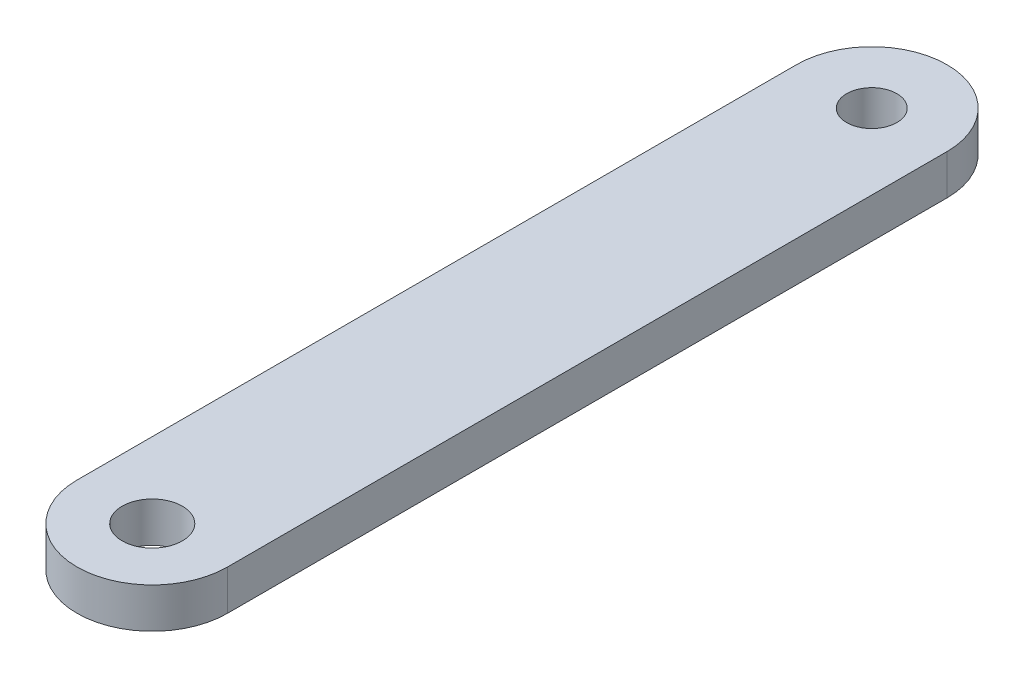
ISO-10303-21;
HEADER;
FILE_DESCRIPTION(('STEP AP214'),'2;1');
FILE_NAME('part.step','',(''),(''),'','','');
FILE_SCHEMA(('AUTOMOTIVE_DESIGN { 1 0 10303 214 1 1 1 1 }'));
ENDSEC;
DATA;
#1=APPLICATION_CONTEXT('core data for automotive mechanical design processes');
#2=APPLICATION_PROTOCOL_DEFINITION('international standard','automotive_design',2000,#1);
#3=PRODUCT_CONTEXT('',#1,'mechanical');
#4=PRODUCT('Part','Part','',(#3));
#5=PRODUCT_RELATED_PRODUCT_CATEGORY('part','',(#4));
#6=PRODUCT_DEFINITION_FORMATION('','',#4);
#7=PRODUCT_DEFINITION_CONTEXT('part definition',#1,'design');
#8=PRODUCT_DEFINITION('design','',#6,#7);
#9=PRODUCT_DEFINITION_SHAPE('','',#8);
#10=(LENGTH_UNIT() NAMED_UNIT(*) SI_UNIT(.MILLI.,.METRE.));
#11=(NAMED_UNIT(*) PLANE_ANGLE_UNIT() SI_UNIT($,.RADIAN.));
#12=(NAMED_UNIT(*) SI_UNIT($,.STERADIAN.) SOLID_ANGLE_UNIT());
#13=UNCERTAINTY_MEASURE_WITH_UNIT(LENGTH_MEASURE(1.E-05),#10,'distance_accuracy_value','');
#14=(GEOMETRIC_REPRESENTATION_CONTEXT(3) GLOBAL_UNCERTAINTY_ASSIGNED_CONTEXT((#13)) GLOBAL_UNIT_ASSIGNED_CONTEXT((#10,
#11,#12)) REPRESENTATION_CONTEXT('',''));
#15=CARTESIAN_POINT('',(0.,0.,0.));
#16=DIRECTION('',(0.,0.,1.));
#17=DIRECTION('',(1.,0.,0.));
#18=AXIS2_PLACEMENT_3D('',#15,#16,#17);
#19=CARTESIAN_POINT('',(1.29120762711864,2.,4.82304025423729));
#20=DIRECTION('',(0.,1.,0.));
#21=DIRECTION('',(0.,0.,1.));
#22=AXIS2_PLACEMENT_3D('',#19,#20,#21);
#23=PLANE('',#22);
#24=CARTESIAN_POINT('',(1.29120762711864,2.,-31.0269597457627));
#25=DIRECTION('',(0.,1.,0.));
#26=DIRECTION('',(0.,0.,1.));
#27=AXIS2_PLACEMENT_3D('',#24,#25,#26);
#28=CIRCLE('',#27,1.25);
#29=CARTESIAN_POINT('',(1.29120762711864,2.,-29.7769597457627));
#30=VERTEX_POINT('',#29);
#31=EDGE_CURVE('E100',#30,#30,#28,.T.);
#32=ORIENTED_EDGE('',*,*,#31,.F.);
#33=EDGE_LOOP('',(#32));
#34=FACE_BOUND('',#33,.T.);
#35=CARTESIAN_POINT('',(1.29120762711864,2.,4.82304025423729));
#36=DIRECTION('',(0.,1.,0.));
#37=DIRECTION('',(0.,0.,1.));
#38=AXIS2_PLACEMENT_3D('',#35,#36,#37);
#39=CIRCLE('',#38,3.75);
#40=CARTESIAN_POINT('',(-2.45879237288136,2.,4.82304025423729));
#41=VERTEX_POINT('',#40);
#42=CARTESIAN_POINT('',(5.04120762711864,2.,4.82304025423729));
#43=VERTEX_POINT('',#42);
#44=EDGE_CURVE('E85',#41,#43,#39,.T.);
#45=ORIENTED_EDGE('',*,*,#44,.T.);
#46=DIRECTION('',(0.,0.,-1.));
#47=VECTOR('',#46,1.);
#48=CARTESIAN_POINT('',(5.04120762711864,2.,-31.0269597457627));
#49=LINE('',#48,#47);
#50=CARTESIAN_POINT('',(5.04120762711864,2.,-31.0269597457627));
#51=VERTEX_POINT('',#50);
#52=EDGE_CURVE('E80',#43,#51,#49,.T.);
#53=ORIENTED_EDGE('',*,*,#52,.T.);
#54=CARTESIAN_POINT('',(1.29120762711864,2.,-31.0269597457627));
#55=DIRECTION('',(0.,1.,0.));
#56=DIRECTION('',(0.,0.,1.));
#57=AXIS2_PLACEMENT_3D('',#54,#55,#56);
#58=CIRCLE('',#57,3.75);
#59=CARTESIAN_POINT('',(-2.45879237288136,2.,-31.0269597457627));
#60=VERTEX_POINT('',#59);
#61=EDGE_CURVE('E83',#51,#60,#58,.T.);
#62=ORIENTED_EDGE('',*,*,#61,.T.);
#63=DIRECTION('',(0.,0.,1.));
#64=VECTOR('',#63,1.);
#65=CARTESIAN_POINT('',(-2.45879237288136,2.,4.82304025423729));
#66=LINE('',#65,#64);
#67=EDGE_CURVE('E50',#60,#41,#66,.T.);
#68=ORIENTED_EDGE('',*,*,#67,.T.);
#69=EDGE_LOOP('',(#45,#53,#62,#68));
#70=FACE_BOUND('',#69,.T.);
#71=CARTESIAN_POINT('',(1.29120762711864,2.,4.82304025423729));
#72=DIRECTION('',(0.,1.,0.));
#73=DIRECTION('',(0.,0.,1.));
#74=AXIS2_PLACEMENT_3D('',#71,#72,#73);
#75=CIRCLE('',#74,1.5);
#76=CARTESIAN_POINT('',(1.29120762711864,2.,6.32304025423729));
#77=VERTEX_POINT('',#76);
#78=EDGE_CURVE('E115',#77,#77,#75,.T.);
#79=ORIENTED_EDGE('',*,*,#78,.F.);
#80=EDGE_LOOP('',(#79));
#81=FACE_BOUND('',#80,.T.);
#82=ADVANCED_FACE('F33',(#34,#70,#81),#23,.T.);
#83=CARTESIAN_POINT('',(1.29120762711864,0.,4.82304025423729));
#84=DIRECTION('',(0.,1.,0.));
#85=DIRECTION('',(0.,0.,1.));
#86=AXIS2_PLACEMENT_3D('',#83,#84,#85);
#87=PLANE('',#86);
#88=CARTESIAN_POINT('',(1.29120762711864,0.,4.82304025423729));
#89=DIRECTION('',(0.,1.,0.));
#90=DIRECTION('',(0.,0.,1.));
#91=AXIS2_PLACEMENT_3D('',#88,#89,#90);
#92=CIRCLE('',#91,3.75);
#93=CARTESIAN_POINT('',(-2.45879237288136,0.,4.82304025423729));
#94=VERTEX_POINT('',#93);
#95=CARTESIAN_POINT('',(5.04120762711864,0.,4.82304025423729));
#96=VERTEX_POINT('',#95);
#97=EDGE_CURVE('E97',#94,#96,#92,.T.);
#98=ORIENTED_EDGE('',*,*,#97,.F.);
#99=DIRECTION('',(0.,0.,1.));
#100=VECTOR('',#99,1.);
#101=CARTESIAN_POINT('',(-2.45879237288136,0.,4.82304025423729));
#102=LINE('',#101,#100);
#103=CARTESIAN_POINT('',(-2.45879237288136,0.,-31.0269597457627));
#104=VERTEX_POINT('',#103);
#105=EDGE_CURVE('E73',#104,#94,#102,.T.);
#106=ORIENTED_EDGE('',*,*,#105,.F.);
#107=CARTESIAN_POINT('',(1.29120762711864,0.,-31.0269597457627));
#108=DIRECTION('',(0.,1.,0.));
#109=DIRECTION('',(0.,0.,1.));
#110=AXIS2_PLACEMENT_3D('',#107,#108,#109);
#111=CIRCLE('',#110,3.75);
#112=CARTESIAN_POINT('',(5.04120762711864,0.,-31.0269597457627));
#113=VERTEX_POINT('',#112);
#114=EDGE_CURVE('E67',#113,#104,#111,.T.);
#115=ORIENTED_EDGE('',*,*,#114,.F.);
#116=DIRECTION('',(0.,0.,-1.));
#117=VECTOR('',#116,1.);
#118=CARTESIAN_POINT('',(5.04120762711864,0.,-31.0269597457627));
#119=LINE('',#118,#117);
#120=EDGE_CURVE('E89',#96,#113,#119,.T.);
#121=ORIENTED_EDGE('',*,*,#120,.F.);
#122=EDGE_LOOP('',(#98,#106,#115,#121));
#123=FACE_BOUND('',#122,.T.);
#124=CARTESIAN_POINT('',(1.29120762711864,0.,-31.0269597457627));
#125=DIRECTION('',(0.,1.,0.));
#126=DIRECTION('',(0.,0.,1.));
#127=AXIS2_PLACEMENT_3D('',#124,#125,#126);
#128=CIRCLE('',#127,1.25);
#129=CARTESIAN_POINT('',(1.29120762711864,0.,-29.7769597457627));
#130=VERTEX_POINT('',#129);
#131=EDGE_CURVE('E112',#130,#130,#128,.T.);
#132=ORIENTED_EDGE('',*,*,#131,.T.);
#133=EDGE_LOOP('',(#132));
#134=FACE_BOUND('',#133,.T.);
#135=CARTESIAN_POINT('',(1.29120762711864,0.,4.82304025423729));
#136=DIRECTION('',(0.,1.,0.));
#137=DIRECTION('',(0.,0.,1.));
#138=AXIS2_PLACEMENT_3D('',#135,#136,#137);
#139=CIRCLE('',#138,1.5);
#140=CARTESIAN_POINT('',(1.29120762711864,0.,6.32304025423729));
#141=VERTEX_POINT('',#140);
#142=EDGE_CURVE('E118',#141,#141,#139,.T.);
#143=ORIENTED_EDGE('',*,*,#142,.T.);
#144=EDGE_LOOP('',(#143));
#145=FACE_BOUND('',#144,.T.);
#146=ADVANCED_FACE('F108',(#123,#134,#145),#87,.F.);
#147=CARTESIAN_POINT('',(1.29120762711864,2.,4.82304025423729));
#148=DIRECTION('',(0.,-1.,0.));
#149=DIRECTION('',(0.,0.,-1.));
#150=AXIS2_PLACEMENT_3D('',#147,#148,#149);
#151=CYLINDRICAL_SURFACE('',#150,3.75);
#152=ORIENTED_EDGE('',*,*,#97,.T.);
#153=DIRECTION('',(0.,-1.,0.));
#154=VECTOR('',#153,1.);
#155=CARTESIAN_POINT('',(5.04120762711864,2.,4.82304025423729));
#156=LINE('',#155,#154);
#157=EDGE_CURVE('E11',#43,#96,#156,.T.);
#158=ORIENTED_EDGE('',*,*,#157,.F.);
#159=ORIENTED_EDGE('',*,*,#44,.F.);
#160=DIRECTION('',(0.,-1.,0.));
#161=VECTOR('',#160,1.);
#162=CARTESIAN_POINT('',(-2.45879237288136,2.,4.82304025423729));
#163=LINE('',#162,#161);
#164=EDGE_CURVE('E93',#41,#94,#163,.T.);
#165=ORIENTED_EDGE('',*,*,#164,.T.);
#166=EDGE_LOOP('',(#152,#158,#159,#165));
#167=FACE_BOUND('',#166,.T.);
#168=ADVANCED_FACE('F35',(#167),#151,.T.);
#169=CARTESIAN_POINT('',(5.04120762711864,2.,-31.0269597457627));
#170=DIRECTION('',(-1.,0.,0.));
#171=DIRECTION('',(0.,0.,1.));
#172=AXIS2_PLACEMENT_3D('',#169,#170,#171);
#173=PLANE('',#172);
#174=ORIENTED_EDGE('',*,*,#120,.T.);
#175=DIRECTION('',(0.,-1.,0.));
#176=VECTOR('',#175,1.);
#177=CARTESIAN_POINT('',(5.04120762711864,2.,-31.0269597457627));
#178=LINE('',#177,#176);
#179=EDGE_CURVE('E42',#51,#113,#178,.T.);
#180=ORIENTED_EDGE('',*,*,#179,.F.);
#181=ORIENTED_EDGE('',*,*,#52,.F.);
#182=ORIENTED_EDGE('',*,*,#157,.T.);
#183=EDGE_LOOP('',(#174,#180,#181,#182));
#184=FACE_BOUND('',#183,.T.);
#185=ADVANCED_FACE('F88',(#184),#173,.F.);
#186=CARTESIAN_POINT('',(1.29120762711864,2.,-31.0269597457627));
#187=DIRECTION('',(0.,-1.,0.));
#188=DIRECTION('',(0.,0.,-1.));
#189=AXIS2_PLACEMENT_3D('',#186,#187,#188);
#190=CYLINDRICAL_SURFACE('',#189,3.75);
#191=ORIENTED_EDGE('',*,*,#114,.T.);
#192=DIRECTION('',(0.,-1.,0.));
#193=VECTOR('',#192,1.);
#194=CARTESIAN_POINT('',(-2.45879237288136,2.,-31.0269597457627));
#195=LINE('',#194,#193);
#196=EDGE_CURVE('E90',#60,#104,#195,.T.);
#197=ORIENTED_EDGE('',*,*,#196,.F.);
#198=ORIENTED_EDGE('',*,*,#61,.F.);
#199=ORIENTED_EDGE('',*,*,#179,.T.);
#200=EDGE_LOOP('',(#191,#197,#198,#199));
#201=FACE_BOUND('',#200,.T.);
#202=ADVANCED_FACE('F91',(#201),#190,.T.);
#203=CARTESIAN_POINT('',(-2.45879237288136,2.,4.82304025423729));
#204=DIRECTION('',(1.,0.,0.));
#205=DIRECTION('',(0.,0.,-1.));
#206=AXIS2_PLACEMENT_3D('',#203,#204,#205);
#207=PLANE('',#206);
#208=ORIENTED_EDGE('',*,*,#105,.T.);
#209=ORIENTED_EDGE('',*,*,#164,.F.);
#210=ORIENTED_EDGE('',*,*,#67,.F.);
#211=ORIENTED_EDGE('',*,*,#196,.T.);
#212=EDGE_LOOP('',(#208,#209,#210,#211));
#213=FACE_BOUND('',#212,.T.);
#214=ADVANCED_FACE('F105',(#213),#207,.F.);
#215=CARTESIAN_POINT('',(1.29120762711864,2.,-31.0269597457627));
#216=DIRECTION('',(0.,-1.,0.));
#217=DIRECTION('',(0.,0.,-1.));
#218=AXIS2_PLACEMENT_3D('',#215,#216,#217);
#219=CYLINDRICAL_SURFACE('',#218,1.25);
#220=ORIENTED_EDGE('',*,*,#31,.T.);
#221=EDGE_LOOP('',(#220));
#222=FACE_BOUND('',#221,.T.);
#223=ORIENTED_EDGE('',*,*,#131,.F.);
#224=EDGE_LOOP('',(#223));
#225=FACE_BOUND('',#224,.T.);
#226=ADVANCED_FACE('F135',(#222,#225),#219,.F.);
#227=CARTESIAN_POINT('',(1.29120762711864,2.,4.82304025423729));
#228=DIRECTION('',(0.,-1.,0.));
#229=DIRECTION('',(0.,0.,-1.));
#230=AXIS2_PLACEMENT_3D('',#227,#228,#229);
#231=CYLINDRICAL_SURFACE('',#230,1.5);
#232=ORIENTED_EDGE('',*,*,#78,.T.);
#233=EDGE_LOOP('',(#232));
#234=FACE_BOUND('',#233,.T.);
#235=ORIENTED_EDGE('',*,*,#142,.F.);
#236=EDGE_LOOP('',(#235));
#237=FACE_BOUND('',#236,.T.);
#238=ADVANCED_FACE('F124',(#234,#237),#231,.F.);
#239=CLOSED_SHELL('',(#82,#146,#168,#185,#202,#214,#226,#238));
#240=MANIFOLD_SOLID_BREP('B2',#239);
#241=ADVANCED_BREP_SHAPE_REPRESENTATION('',(#18,#240),#14);
#242=SHAPE_DEFINITION_REPRESENTATION(#9,#241);
ENDSEC;
END-ISO-10303-21;
